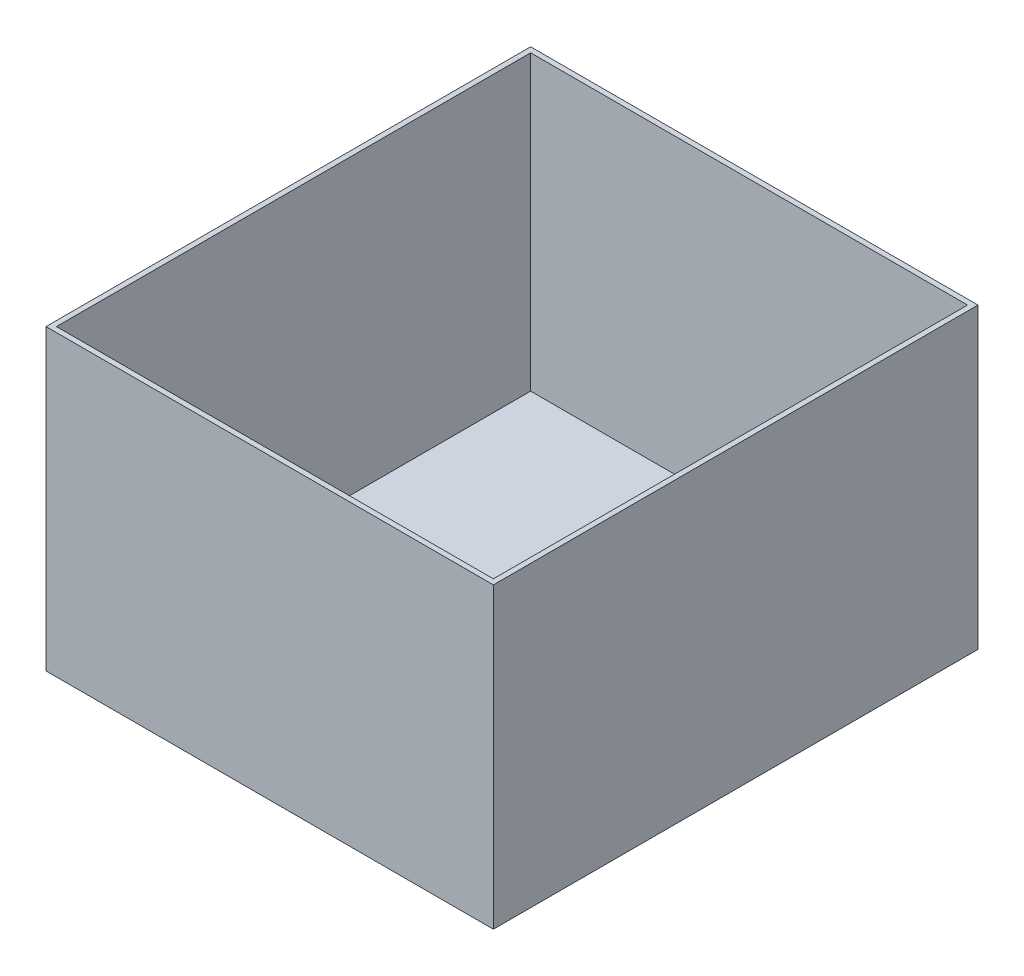
ISO-10303-21;
HEADER;
FILE_DESCRIPTION(('STEP AP214'),'2;1');
FILE_NAME('part.step','',(''),(''),'','','');
FILE_SCHEMA(('AUTOMOTIVE_DESIGN { 1 0 10303 214 1 1 1 1 }'));
ENDSEC;
DATA;
#1=APPLICATION_CONTEXT('core data for automotive mechanical design processes');
#2=APPLICATION_PROTOCOL_DEFINITION('international standard','automotive_design',2000,#1);
#3=PRODUCT_CONTEXT('',#1,'mechanical');
#4=PRODUCT('Part','Part','',(#3));
#5=PRODUCT_RELATED_PRODUCT_CATEGORY('part','',(#4));
#6=PRODUCT_DEFINITION_FORMATION('','',#4);
#7=PRODUCT_DEFINITION_CONTEXT('part definition',#1,'design');
#8=PRODUCT_DEFINITION('design','',#6,#7);
#9=PRODUCT_DEFINITION_SHAPE('','',#8);
#10=(LENGTH_UNIT() NAMED_UNIT(*) SI_UNIT(.MILLI.,.METRE.));
#11=(NAMED_UNIT(*) PLANE_ANGLE_UNIT() SI_UNIT($,.RADIAN.));
#12=(NAMED_UNIT(*) SI_UNIT($,.STERADIAN.) SOLID_ANGLE_UNIT());
#13=UNCERTAINTY_MEASURE_WITH_UNIT(LENGTH_MEASURE(1.E-05),#10,'distance_accuracy_value','');
#14=(GEOMETRIC_REPRESENTATION_CONTEXT(3) GLOBAL_UNCERTAINTY_ASSIGNED_CONTEXT((#13)) GLOBAL_UNIT_ASSIGNED_CONTEXT((#10,
#11,#12)) REPRESENTATION_CONTEXT('',''));
#15=CARTESIAN_POINT('',(0.,0.,0.));
#16=DIRECTION('',(0.,0.,1.));
#17=DIRECTION('',(1.,0.,0.));
#18=AXIS2_PLACEMENT_3D('',#15,#16,#17);
#19=CARTESIAN_POINT('',(0.,101.6,0.));
#20=DIRECTION('',(1.,0.,0.));
#21=DIRECTION('',(0.,0.,-1.));
#22=AXIS2_PLACEMENT_3D('',#19,#20,#21);
#23=PLANE('',#22);
#24=DIRECTION('',(0.,0.,1.));
#25=VECTOR('',#24,1.);
#26=CARTESIAN_POINT('',(0.,0.,0.));
#27=LINE('',#26,#25);
#28=CARTESIAN_POINT('',(0.,0.,-165.1));
#29=VERTEX_POINT('',#28);
#30=CARTESIAN_POINT('',(0.,0.,0.));
#31=VERTEX_POINT('',#30);
#32=EDGE_CURVE('E141',#29,#31,#27,.T.);
#33=ORIENTED_EDGE('',*,*,#32,.T.);
#34=DIRECTION('',(0.,-1.,0.));
#35=VECTOR('',#34,1.);
#36=CARTESIAN_POINT('',(0.,101.6,0.));
#37=LINE('',#36,#35);
#38=CARTESIAN_POINT('',(0.,101.6,0.));
#39=VERTEX_POINT('',#38);
#40=EDGE_CURVE('E11',#39,#31,#37,.T.);
#41=ORIENTED_EDGE('',*,*,#40,.F.);
#42=DIRECTION('',(0.,0.,1.));
#43=VECTOR('',#42,1.);
#44=CARTESIAN_POINT('',(0.,101.6,0.));
#45=LINE('',#44,#43);
#46=CARTESIAN_POINT('',(0.,101.6,-165.1));
#47=VERTEX_POINT('',#46);
#48=EDGE_CURVE('E145',#47,#39,#45,.T.);
#49=ORIENTED_EDGE('',*,*,#48,.F.);
#50=DIRECTION('',(0.,-1.,0.));
#51=VECTOR('',#50,1.);
#52=CARTESIAN_POINT('',(0.,101.6,-165.1));
#53=LINE('',#52,#51);
#54=EDGE_CURVE('E151',#47,#29,#53,.T.);
#55=ORIENTED_EDGE('',*,*,#54,.T.);
#56=EDGE_LOOP('',(#33,#41,#49,#55));
#57=FACE_BOUND('',#56,.T.);
#58=ADVANCED_FACE('F33',(#57),#23,.F.);
#59=CARTESIAN_POINT('',(0.,101.6,0.));
#60=DIRECTION('',(0.,0.,-1.));
#61=DIRECTION('',(-1.,0.,0.));
#62=AXIS2_PLACEMENT_3D('',#59,#60,#61);
#63=PLANE('',#62);
#64=DIRECTION('',(1.,0.,0.));
#65=VECTOR('',#64,1.);
#66=CARTESIAN_POINT('',(0.,0.,0.));
#67=LINE('',#66,#65);
#68=CARTESIAN_POINT('',(152.4,0.,0.));
#69=VERTEX_POINT('',#68);
#70=EDGE_CURVE('E154',#31,#69,#67,.T.);
#71=ORIENTED_EDGE('',*,*,#70,.T.);
#72=DIRECTION('',(0.,-1.,0.));
#73=VECTOR('',#72,1.);
#74=CARTESIAN_POINT('',(152.4,101.6,0.));
#75=LINE('',#74,#73);
#76=CARTESIAN_POINT('',(152.4,101.6,0.));
#77=VERTEX_POINT('',#76);
#78=EDGE_CURVE('E40',#77,#69,#75,.T.);
#79=ORIENTED_EDGE('',*,*,#78,.F.);
#80=DIRECTION('',(1.,0.,0.));
#81=VECTOR('',#80,1.);
#82=CARTESIAN_POINT('',(0.,101.6,0.));
#83=LINE('',#82,#81);
#84=EDGE_CURVE('E84',#39,#77,#83,.T.);
#85=ORIENTED_EDGE('',*,*,#84,.F.);
#86=ORIENTED_EDGE('',*,*,#40,.T.);
#87=EDGE_LOOP('',(#71,#79,#85,#86));
#88=FACE_BOUND('',#87,.T.);
#89=ADVANCED_FACE('F183',(#88),#63,.F.);
#90=CARTESIAN_POINT('',(152.4,101.6,0.));
#91=DIRECTION('',(-1.,0.,0.));
#92=DIRECTION('',(0.,0.,1.));
#93=AXIS2_PLACEMENT_3D('',#90,#91,#92);
#94=PLANE('',#93);
#95=DIRECTION('',(0.,0.,-1.));
#96=VECTOR('',#95,1.);
#97=CARTESIAN_POINT('',(152.4,0.,0.));
#98=LINE('',#97,#96);
#99=CARTESIAN_POINT('',(152.4,0.,-165.1));
#100=VERTEX_POINT('',#99);
#101=EDGE_CURVE('E156',#69,#100,#98,.T.);
#102=ORIENTED_EDGE('',*,*,#101,.T.);
#103=DIRECTION('',(0.,-1.,0.));
#104=VECTOR('',#103,1.);
#105=CARTESIAN_POINT('',(152.4,101.6,-165.1));
#106=LINE('',#105,#104);
#107=CARTESIAN_POINT('',(152.4,101.6,-165.1));
#108=VERTEX_POINT('',#107);
#109=EDGE_CURVE('E160',#108,#100,#106,.T.);
#110=ORIENTED_EDGE('',*,*,#109,.F.);
#111=DIRECTION('',(0.,0.,-1.));
#112=VECTOR('',#111,1.);
#113=CARTESIAN_POINT('',(152.4,101.6,0.));
#114=LINE('',#113,#112);
#115=EDGE_CURVE('E148',#77,#108,#114,.T.);
#116=ORIENTED_EDGE('',*,*,#115,.F.);
#117=ORIENTED_EDGE('',*,*,#78,.T.);
#118=EDGE_LOOP('',(#102,#110,#116,#117));
#119=FACE_BOUND('',#118,.T.);
#120=ADVANCED_FACE('F165',(#119),#94,.F.);
#121=CARTESIAN_POINT('',(0.,101.6,-165.1));
#122=DIRECTION('',(0.,0.,1.));
#123=DIRECTION('',(1.,0.,0.));
#124=AXIS2_PLACEMENT_3D('',#121,#122,#123);
#125=PLANE('',#124);
#126=DIRECTION('',(-1.,0.,0.));
#127=VECTOR('',#126,1.);
#128=CARTESIAN_POINT('',(0.,0.,-165.1));
#129=LINE('',#128,#127);
#130=EDGE_CURVE('E77',#100,#29,#129,.T.);
#131=ORIENTED_EDGE('',*,*,#130,.T.);
#132=ORIENTED_EDGE('',*,*,#54,.F.);
#133=DIRECTION('',(-1.,0.,0.));
#134=VECTOR('',#133,1.);
#135=CARTESIAN_POINT('',(0.,101.6,-165.1));
#136=LINE('',#135,#134);
#137=EDGE_CURVE('E56',#108,#47,#136,.T.);
#138=ORIENTED_EDGE('',*,*,#137,.F.);
#139=ORIENTED_EDGE('',*,*,#109,.T.);
#140=EDGE_LOOP('',(#131,#132,#138,#139));
#141=FACE_BOUND('',#140,.T.);
#142=ADVANCED_FACE('F173',(#141),#125,.F.);
#143=CARTESIAN_POINT('',(0.,101.6,0.));
#144=DIRECTION('',(0.,-1.,0.));
#145=DIRECTION('',(0.,0.,-1.));
#146=AXIS2_PLACEMENT_3D('',#143,#144,#145);
#147=PLANE('',#146);
#148=DIRECTION('',(1.,0.,0.));
#149=VECTOR('',#148,1.);
#150=CARTESIAN_POINT('',(1.778,101.6,-1.778));
#151=LINE('',#150,#149);
#152=CARTESIAN_POINT('',(1.778,101.6,-1.778));
#153=VERTEX_POINT('',#152);
#154=CARTESIAN_POINT('',(150.622,101.6,-1.778));
#155=VERTEX_POINT('',#154);
#156=EDGE_CURVE('E135',#153,#155,#151,.T.);
#157=ORIENTED_EDGE('',*,*,#156,.F.);
#158=DIRECTION('',(0.,0.,1.));
#159=VECTOR('',#158,1.);
#160=CARTESIAN_POINT('',(1.77799999999997,101.6,-163.322));
#161=LINE('',#160,#159);
#162=CARTESIAN_POINT('',(1.77799999999997,101.6,-163.322));
#163=VERTEX_POINT('',#162);
#164=EDGE_CURVE('E47',#163,#153,#161,.T.);
#165=ORIENTED_EDGE('',*,*,#164,.F.);
#166=DIRECTION('',(-1.,0.,0.));
#167=VECTOR('',#166,1.);
#168=CARTESIAN_POINT('',(150.622,101.6,-163.322));
#169=LINE('',#168,#167);
#170=CARTESIAN_POINT('',(150.622,101.6,-163.322));
#171=VERTEX_POINT('',#170);
#172=EDGE_CURVE('E126',#171,#163,#169,.T.);
#173=ORIENTED_EDGE('',*,*,#172,.F.);
#174=DIRECTION('',(0.,0.,-1.));
#175=VECTOR('',#174,1.);
#176=CARTESIAN_POINT('',(150.622,101.6,-1.778));
#177=LINE('',#176,#175);
#178=EDGE_CURVE('E129',#155,#171,#177,.T.);
#179=ORIENTED_EDGE('',*,*,#178,.F.);
#180=EDGE_LOOP('',(#157,#165,#173,#179));
#181=FACE_BOUND('',#180,.T.);
#182=ORIENTED_EDGE('',*,*,#48,.T.);
#183=ORIENTED_EDGE('',*,*,#84,.T.);
#184=ORIENTED_EDGE('',*,*,#115,.T.);
#185=ORIENTED_EDGE('',*,*,#137,.T.);
#186=EDGE_LOOP('',(#182,#183,#184,#185));
#187=FACE_BOUND('',#186,.T.);
#188=ADVANCED_FACE('F175',(#181,#187),#147,.F.);
#189=CARTESIAN_POINT('',(0.,0.,0.));
#190=DIRECTION('',(0.,-1.,0.));
#191=DIRECTION('',(0.,0.,-1.));
#192=AXIS2_PLACEMENT_3D('',#189,#190,#191);
#193=PLANE('',#192);
#194=ORIENTED_EDGE('',*,*,#32,.F.);
#195=ORIENTED_EDGE('',*,*,#130,.F.);
#196=ORIENTED_EDGE('',*,*,#101,.F.);
#197=ORIENTED_EDGE('',*,*,#70,.F.);
#198=EDGE_LOOP('',(#194,#195,#196,#197));
#199=FACE_BOUND('',#198,.T.);
#200=ADVANCED_FACE('F169',(#199),#193,.T.);
#201=CARTESIAN_POINT('',(1.77799999999997,1.77799999999999,-163.322));
#202=DIRECTION('',(-1.,0.,0.));
#203=DIRECTION('',(0.,0.,1.));
#204=AXIS2_PLACEMENT_3D('',#201,#202,#203);
#205=PLANE('',#204);
#206=ORIENTED_EDGE('',*,*,#164,.T.);
#207=DIRECTION('',(0.,1.,0.));
#208=VECTOR('',#207,1.);
#209=CARTESIAN_POINT('',(1.778,1.77799999999999,-1.778));
#210=LINE('',#209,#208);
#211=CARTESIAN_POINT('',(1.778,1.77799999999999,-1.778));
#212=VERTEX_POINT('',#211);
#213=EDGE_CURVE('E104',#212,#153,#210,.T.);
#214=ORIENTED_EDGE('',*,*,#213,.F.);
#215=DIRECTION('',(0.,0.,1.));
#216=VECTOR('',#215,1.);
#217=CARTESIAN_POINT('',(1.77799999999997,1.77799999999999,-163.322));
#218=LINE('',#217,#216);
#219=CARTESIAN_POINT('',(1.77799999999997,1.77799999999999,-163.322));
#220=VERTEX_POINT('',#219);
#221=EDGE_CURVE('E108',#220,#212,#218,.T.);
#222=ORIENTED_EDGE('',*,*,#221,.F.);
#223=DIRECTION('',(0.,1.,0.));
#224=VECTOR('',#223,1.);
#225=CARTESIAN_POINT('',(1.77799999999997,1.77799999999999,-163.322));
#226=LINE('',#225,#224);
#227=EDGE_CURVE('E139',#220,#163,#226,.T.);
#228=ORIENTED_EDGE('',*,*,#227,.T.);
#229=EDGE_LOOP('',(#206,#214,#222,#228));
#230=FACE_BOUND('',#229,.T.);
#231=ADVANCED_FACE('F106',(#230),#205,.F.);
#232=CARTESIAN_POINT('',(150.622,1.77799999999999,-163.322));
#233=DIRECTION('',(0.,0.,-1.));
#234=DIRECTION('',(-1.,0.,0.));
#235=AXIS2_PLACEMENT_3D('',#232,#233,#234);
#236=PLANE('',#235);
#237=ORIENTED_EDGE('',*,*,#172,.T.);
#238=ORIENTED_EDGE('',*,*,#227,.F.);
#239=DIRECTION('',(-1.,0.,0.));
#240=VECTOR('',#239,1.);
#241=CARTESIAN_POINT('',(150.622,1.77799999999999,-163.322));
#242=LINE('',#241,#240);
#243=CARTESIAN_POINT('',(150.622,1.77799999999999,-163.322));
#244=VERTEX_POINT('',#243);
#245=EDGE_CURVE('E114',#244,#220,#242,.T.);
#246=ORIENTED_EDGE('',*,*,#245,.F.);
#247=DIRECTION('',(0.,1.,0.));
#248=VECTOR('',#247,1.);
#249=CARTESIAN_POINT('',(150.622,1.77799999999999,-163.322));
#250=LINE('',#249,#248);
#251=EDGE_CURVE('E142',#244,#171,#250,.T.);
#252=ORIENTED_EDGE('',*,*,#251,.T.);
#253=EDGE_LOOP('',(#237,#238,#246,#252));
#254=FACE_BOUND('',#253,.T.);
#255=ADVANCED_FACE('F222',(#254),#236,.F.);
#256=CARTESIAN_POINT('',(150.622,1.77799999999999,-1.778));
#257=DIRECTION('',(1.,0.,0.));
#258=DIRECTION('',(0.,0.,-1.));
#259=AXIS2_PLACEMENT_3D('',#256,#257,#258);
#260=PLANE('',#259);
#261=ORIENTED_EDGE('',*,*,#178,.T.);
#262=ORIENTED_EDGE('',*,*,#251,.F.);
#263=DIRECTION('',(0.,0.,-1.));
#264=VECTOR('',#263,1.);
#265=CARTESIAN_POINT('',(150.622,1.77799999999999,-1.778));
#266=LINE('',#265,#264);
#267=CARTESIAN_POINT('',(150.622,1.77799999999999,-1.778));
#268=VERTEX_POINT('',#267);
#269=EDGE_CURVE('E122',#268,#244,#266,.T.);
#270=ORIENTED_EDGE('',*,*,#269,.F.);
#271=DIRECTION('',(0.,1.,0.));
#272=VECTOR('',#271,1.);
#273=CARTESIAN_POINT('',(150.622,1.77799999999999,-1.778));
#274=LINE('',#273,#272);
#275=EDGE_CURVE('E113',#268,#155,#274,.T.);
#276=ORIENTED_EDGE('',*,*,#275,.T.);
#277=EDGE_LOOP('',(#261,#262,#270,#276));
#278=FACE_BOUND('',#277,.T.);
#279=ADVANCED_FACE('F231',(#278),#260,.F.);
#280=CARTESIAN_POINT('',(1.778,1.77799999999999,-1.778));
#281=DIRECTION('',(0.,0.,1.));
#282=DIRECTION('',(1.,0.,0.));
#283=AXIS2_PLACEMENT_3D('',#280,#281,#282);
#284=PLANE('',#283);
#285=ORIENTED_EDGE('',*,*,#156,.T.);
#286=ORIENTED_EDGE('',*,*,#275,.F.);
#287=DIRECTION('',(1.,0.,0.));
#288=VECTOR('',#287,1.);
#289=CARTESIAN_POINT('',(1.778,1.77799999999999,-1.778));
#290=LINE('',#289,#288);
#291=EDGE_CURVE('E117',#212,#268,#290,.T.);
#292=ORIENTED_EDGE('',*,*,#291,.F.);
#293=ORIENTED_EDGE('',*,*,#213,.T.);
#294=EDGE_LOOP('',(#285,#286,#292,#293));
#295=FACE_BOUND('',#294,.T.);
#296=ADVANCED_FACE('F118',(#295),#284,.F.);
#297=CARTESIAN_POINT('',(0.,1.77799999999999,0.));
#298=DIRECTION('',(0.,1.,0.));
#299=DIRECTION('',(0.,0.,1.));
#300=AXIS2_PLACEMENT_3D('',#297,#298,#299);
#301=PLANE('',#300);
#302=ORIENTED_EDGE('',*,*,#221,.T.);
#303=ORIENTED_EDGE('',*,*,#291,.T.);
#304=ORIENTED_EDGE('',*,*,#269,.T.);
#305=ORIENTED_EDGE('',*,*,#245,.T.);
#306=EDGE_LOOP('',(#302,#303,#304,#305));
#307=FACE_BOUND('',#306,.T.);
#308=ADVANCED_FACE('F124',(#307),#301,.T.);
#309=CLOSED_SHELL('',(#58,#89,#120,#142,#188,#200,#231,#255,#279,#296,#308));
#310=MANIFOLD_SOLID_BREP('B2',#309);
#311=ADVANCED_BREP_SHAPE_REPRESENTATION('',(#18,#310),#14);
#312=SHAPE_DEFINITION_REPRESENTATION(#9,#311);
ENDSEC;
END-ISO-10303-21;
